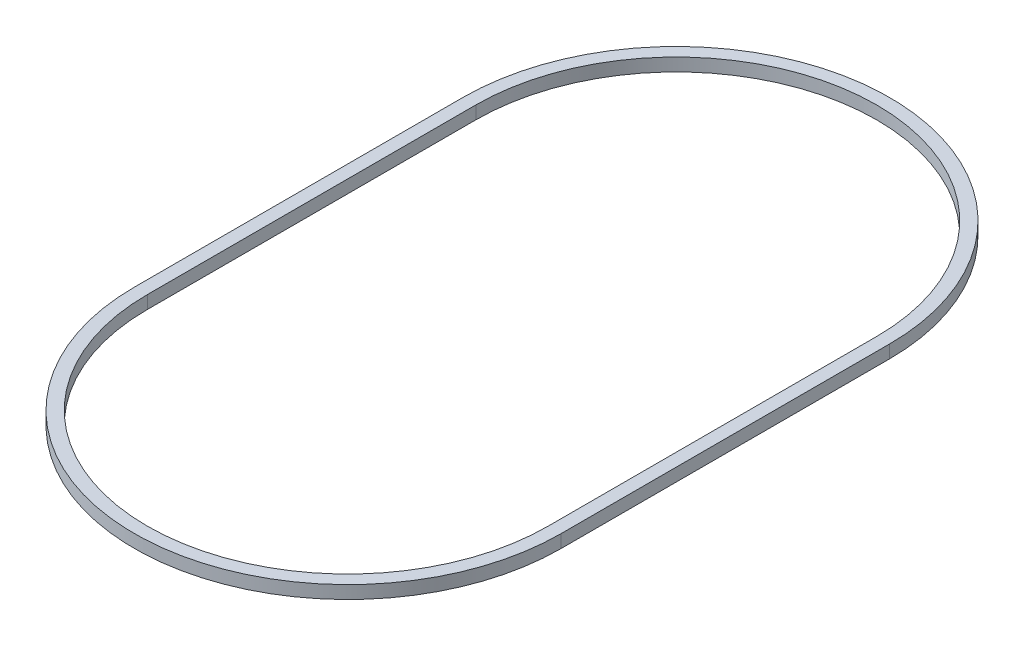
ISO-10303-21;
HEADER;
FILE_DESCRIPTION(('STEP AP214'),'2;1');
FILE_NAME('part.step','',(''),(''),'','','');
FILE_SCHEMA(('AUTOMOTIVE_DESIGN { 1 0 10303 214 1 1 1 1 }'));
ENDSEC;
DATA;
#1=APPLICATION_CONTEXT('core data for automotive mechanical design processes');
#2=APPLICATION_PROTOCOL_DEFINITION('international standard','automotive_design',2000,#1);
#3=PRODUCT_CONTEXT('',#1,'mechanical');
#4=PRODUCT('Part','Part','',(#3));
#5=PRODUCT_RELATED_PRODUCT_CATEGORY('part','',(#4));
#6=PRODUCT_DEFINITION_FORMATION('','',#4);
#7=PRODUCT_DEFINITION_CONTEXT('part definition',#1,'design');
#8=PRODUCT_DEFINITION('design','',#6,#7);
#9=PRODUCT_DEFINITION_SHAPE('','',#8);
#10=(LENGTH_UNIT() NAMED_UNIT(*) SI_UNIT(.MILLI.,.METRE.));
#11=(NAMED_UNIT(*) PLANE_ANGLE_UNIT() SI_UNIT($,.RADIAN.));
#12=(NAMED_UNIT(*) SI_UNIT($,.STERADIAN.) SOLID_ANGLE_UNIT());
#13=UNCERTAINTY_MEASURE_WITH_UNIT(LENGTH_MEASURE(1.E-05),#10,'distance_accuracy_value','');
#14=(GEOMETRIC_REPRESENTATION_CONTEXT(3) GLOBAL_UNCERTAINTY_ASSIGNED_CONTEXT((#13)) GLOBAL_UNIT_ASSIGNED_CONTEXT((#10,
#11,#12)) REPRESENTATION_CONTEXT('',''));
#15=CARTESIAN_POINT('',(0.,0.,0.));
#16=DIRECTION('',(0.,0.,1.));
#17=DIRECTION('',(1.,0.,0.));
#18=AXIS2_PLACEMENT_3D('',#15,#16,#17);
#19=CARTESIAN_POINT('',(0.,2.5,-31.75));
#20=DIRECTION('',(0.,1.,0.));
#21=DIRECTION('',(0.,0.,1.));
#22=AXIS2_PLACEMENT_3D('',#19,#20,#21);
#23=PLANE('',#22);
#24=CARTESIAN_POINT('',(0.,2.5,-31.75));
#25=DIRECTION('',(0.,1.,0.));
#26=DIRECTION('',(0.,0.,1.));
#27=AXIS2_PLACEMENT_3D('',#24,#25,#26);
#28=CIRCLE('',#27,41.25);
#29=CARTESIAN_POINT('',(41.25,2.5,-31.75));
#30=VERTEX_POINT('',#29);
#31=CARTESIAN_POINT('',(-41.25,2.5,-31.75));
#32=VERTEX_POINT('',#31);
#33=EDGE_CURVE('E134',#30,#32,#28,.T.);
#34=ORIENTED_EDGE('',*,*,#33,.T.);
#35=DIRECTION('',(0.,0.,1.));
#36=VECTOR('',#35,1.);
#37=CARTESIAN_POINT('',(-41.25,2.5,-31.75));
#38=LINE('',#37,#36);
#39=CARTESIAN_POINT('',(-41.25,2.5,31.75));
#40=VERTEX_POINT('',#39);
#41=EDGE_CURVE('E137',#32,#40,#38,.T.);
#42=ORIENTED_EDGE('',*,*,#41,.T.);
#43=CARTESIAN_POINT('',(0.,2.5,31.75));
#44=DIRECTION('',(0.,1.,0.));
#45=DIRECTION('',(0.,0.,1.));
#46=AXIS2_PLACEMENT_3D('',#43,#44,#45);
#47=CIRCLE('',#46,41.25);
#48=CARTESIAN_POINT('',(41.25,2.5,31.75));
#49=VERTEX_POINT('',#48);
#50=EDGE_CURVE('E140',#40,#49,#47,.T.);
#51=ORIENTED_EDGE('',*,*,#50,.T.);
#52=DIRECTION('',(0.,0.,-1.));
#53=VECTOR('',#52,1.);
#54=CARTESIAN_POINT('',(41.25,2.5,-31.75));
#55=LINE('',#54,#53);
#56=EDGE_CURVE('E142',#49,#30,#55,.T.);
#57=ORIENTED_EDGE('',*,*,#56,.T.);
#58=EDGE_LOOP('',(#34,#42,#51,#57));
#59=FACE_BOUND('',#58,.T.);
#60=DIRECTION('',(0.,0.,1.));
#61=VECTOR('',#60,1.);
#62=CARTESIAN_POINT('',(-38.75,2.5,-31.75));
#63=LINE('',#62,#61);
#64=CARTESIAN_POINT('',(-38.75,2.5,-31.75));
#65=VERTEX_POINT('',#64);
#66=CARTESIAN_POINT('',(-38.75,2.5,31.75));
#67=VERTEX_POINT('',#66);
#68=EDGE_CURVE('E106',#65,#67,#63,.T.);
#69=ORIENTED_EDGE('',*,*,#68,.F.);
#70=CARTESIAN_POINT('',(0.,2.5,-31.75));
#71=DIRECTION('',(0.,1.,0.));
#72=DIRECTION('',(0.,0.,1.));
#73=AXIS2_PLACEMENT_3D('',#70,#71,#72);
#74=CIRCLE('',#73,38.75);
#75=CARTESIAN_POINT('',(38.75,2.5,-31.75));
#76=VERTEX_POINT('',#75);
#77=EDGE_CURVE('E98',#76,#65,#74,.T.);
#78=ORIENTED_EDGE('',*,*,#77,.F.);
#79=DIRECTION('',(0.,0.,-1.));
#80=VECTOR('',#79,1.);
#81=CARTESIAN_POINT('',(38.75,2.5,-31.75));
#82=LINE('',#81,#80);
#83=CARTESIAN_POINT('',(38.75,2.5,31.75));
#84=VERTEX_POINT('',#83);
#85=EDGE_CURVE('E120',#84,#76,#82,.T.);
#86=ORIENTED_EDGE('',*,*,#85,.F.);
#87=CARTESIAN_POINT('',(0.,2.5,31.75));
#88=DIRECTION('',(0.,1.,0.));
#89=DIRECTION('',(0.,0.,1.));
#90=AXIS2_PLACEMENT_3D('',#87,#88,#89);
#91=CIRCLE('',#90,38.75);
#92=EDGE_CURVE('E118',#67,#84,#91,.T.);
#93=ORIENTED_EDGE('',*,*,#92,.F.);
#94=EDGE_LOOP('',(#69,#78,#86,#93));
#95=FACE_BOUND('',#94,.T.);
#96=ADVANCED_FACE('F33',(#59,#95),#23,.T.);
#97=CARTESIAN_POINT('',(0.,0.,-31.75));
#98=DIRECTION('',(0.,1.,0.));
#99=DIRECTION('',(0.,0.,1.));
#100=AXIS2_PLACEMENT_3D('',#97,#98,#99);
#101=PLANE('',#100);
#102=CARTESIAN_POINT('',(0.,0.,-31.75));
#103=DIRECTION('',(0.,1.,0.));
#104=DIRECTION('',(0.,0.,1.));
#105=AXIS2_PLACEMENT_3D('',#102,#103,#104);
#106=CIRCLE('',#105,41.25);
#107=CARTESIAN_POINT('',(41.25,0.,-31.75));
#108=VERTEX_POINT('',#107);
#109=CARTESIAN_POINT('',(-41.25,0.,-31.75));
#110=VERTEX_POINT('',#109);
#111=EDGE_CURVE('E114',#108,#110,#106,.T.);
#112=ORIENTED_EDGE('',*,*,#111,.F.);
#113=DIRECTION('',(0.,0.,-1.));
#114=VECTOR('',#113,1.);
#115=CARTESIAN_POINT('',(41.25,0.,-31.75));
#116=LINE('',#115,#114);
#117=CARTESIAN_POINT('',(41.25,0.,31.75));
#118=VERTEX_POINT('',#117);
#119=EDGE_CURVE('E138',#118,#108,#116,.T.);
#120=ORIENTED_EDGE('',*,*,#119,.F.);
#121=CARTESIAN_POINT('',(0.,0.,31.75));
#122=DIRECTION('',(0.,1.,0.));
#123=DIRECTION('',(0.,0.,1.));
#124=AXIS2_PLACEMENT_3D('',#121,#122,#123);
#125=CIRCLE('',#124,41.25);
#126=CARTESIAN_POINT('',(-41.25,0.,31.75));
#127=VERTEX_POINT('',#126);
#128=EDGE_CURVE('E149',#127,#118,#125,.T.);
#129=ORIENTED_EDGE('',*,*,#128,.F.);
#130=DIRECTION('',(0.,0.,1.));
#131=VECTOR('',#130,1.);
#132=CARTESIAN_POINT('',(-41.25,0.,-31.75));
#133=LINE('',#132,#131);
#134=EDGE_CURVE('E147',#110,#127,#133,.T.);
#135=ORIENTED_EDGE('',*,*,#134,.F.);
#136=EDGE_LOOP('',(#112,#120,#129,#135));
#137=FACE_BOUND('',#136,.T.);
#138=CARTESIAN_POINT('',(0.,0.,-31.75));
#139=DIRECTION('',(0.,1.,0.));
#140=DIRECTION('',(0.,0.,1.));
#141=AXIS2_PLACEMENT_3D('',#138,#139,#140);
#142=CIRCLE('',#141,38.75);
#143=CARTESIAN_POINT('',(38.75,0.,-31.75));
#144=VERTEX_POINT('',#143);
#145=CARTESIAN_POINT('',(-38.75,0.,-31.75));
#146=VERTEX_POINT('',#145);
#147=EDGE_CURVE('E56',#144,#146,#142,.T.);
#148=ORIENTED_EDGE('',*,*,#147,.T.);
#149=DIRECTION('',(0.,0.,1.));
#150=VECTOR('',#149,1.);
#151=CARTESIAN_POINT('',(-38.75,0.,-31.75));
#152=LINE('',#151,#150);
#153=CARTESIAN_POINT('',(-38.75,0.,31.75));
#154=VERTEX_POINT('',#153);
#155=EDGE_CURVE('E113',#146,#154,#152,.T.);
#156=ORIENTED_EDGE('',*,*,#155,.T.);
#157=CARTESIAN_POINT('',(0.,0.,31.75));
#158=DIRECTION('',(0.,1.,0.));
#159=DIRECTION('',(0.,0.,1.));
#160=AXIS2_PLACEMENT_3D('',#157,#158,#159);
#161=CIRCLE('',#160,38.75);
#162=CARTESIAN_POINT('',(38.75,0.,31.75));
#163=VERTEX_POINT('',#162);
#164=EDGE_CURVE('E126',#154,#163,#161,.T.);
#165=ORIENTED_EDGE('',*,*,#164,.T.);
#166=DIRECTION('',(0.,0.,-1.));
#167=VECTOR('',#166,1.);
#168=CARTESIAN_POINT('',(38.75,0.,-31.75));
#169=LINE('',#168,#167);
#170=EDGE_CURVE('E107',#163,#144,#169,.T.);
#171=ORIENTED_EDGE('',*,*,#170,.T.);
#172=EDGE_LOOP('',(#148,#156,#165,#171));
#173=FACE_BOUND('',#172,.T.);
#174=ADVANCED_FACE('F167',(#137,#173),#101,.F.);
#175=CARTESIAN_POINT('',(0.,2.5,-31.75));
#176=DIRECTION('',(0.,-1.,0.));
#177=DIRECTION('',(0.,0.,-1.));
#178=AXIS2_PLACEMENT_3D('',#175,#176,#177);
#179=CYLINDRICAL_SURFACE('',#178,41.25);
#180=ORIENTED_EDGE('',*,*,#111,.T.);
#181=DIRECTION('',(0.,-1.,0.));
#182=VECTOR('',#181,1.);
#183=CARTESIAN_POINT('',(-41.25,2.5,-31.75));
#184=LINE('',#183,#182);
#185=EDGE_CURVE('E11',#32,#110,#184,.T.);
#186=ORIENTED_EDGE('',*,*,#185,.F.);
#187=ORIENTED_EDGE('',*,*,#33,.F.);
#188=DIRECTION('',(0.,-1.,0.));
#189=VECTOR('',#188,1.);
#190=CARTESIAN_POINT('',(41.25,2.5,-31.75));
#191=LINE('',#190,#189);
#192=EDGE_CURVE('E144',#30,#108,#191,.T.);
#193=ORIENTED_EDGE('',*,*,#192,.T.);
#194=EDGE_LOOP('',(#180,#186,#187,#193));
#195=FACE_BOUND('',#194,.T.);
#196=ADVANCED_FACE('F35',(#195),#179,.T.);
#197=CARTESIAN_POINT('',(-41.25,2.5,-31.75));
#198=DIRECTION('',(1.,0.,0.));
#199=DIRECTION('',(0.,0.,-1.));
#200=AXIS2_PLACEMENT_3D('',#197,#198,#199);
#201=PLANE('',#200);
#202=ORIENTED_EDGE('',*,*,#134,.T.);
#203=DIRECTION('',(0.,-1.,0.));
#204=VECTOR('',#203,1.);
#205=CARTESIAN_POINT('',(-41.25,2.5,31.75));
#206=LINE('',#205,#204);
#207=EDGE_CURVE('E41',#40,#127,#206,.T.);
#208=ORIENTED_EDGE('',*,*,#207,.F.);
#209=ORIENTED_EDGE('',*,*,#41,.F.);
#210=ORIENTED_EDGE('',*,*,#185,.T.);
#211=EDGE_LOOP('',(#202,#208,#209,#210));
#212=FACE_BOUND('',#211,.T.);
#213=ADVANCED_FACE('F177',(#212),#201,.F.);
#214=CARTESIAN_POINT('',(0.,2.5,31.75));
#215=DIRECTION('',(0.,-1.,0.));
#216=DIRECTION('',(0.,0.,-1.));
#217=AXIS2_PLACEMENT_3D('',#214,#215,#216);
#218=CYLINDRICAL_SURFACE('',#217,41.25);
#219=ORIENTED_EDGE('',*,*,#128,.T.);
#220=DIRECTION('',(0.,-1.,0.));
#221=VECTOR('',#220,1.);
#222=CARTESIAN_POINT('',(41.25,2.5,31.75));
#223=LINE('',#222,#221);
#224=EDGE_CURVE('E154',#49,#118,#223,.T.);
#225=ORIENTED_EDGE('',*,*,#224,.F.);
#226=ORIENTED_EDGE('',*,*,#50,.F.);
#227=ORIENTED_EDGE('',*,*,#207,.T.);
#228=EDGE_LOOP('',(#219,#225,#226,#227));
#229=FACE_BOUND('',#228,.T.);
#230=ADVANCED_FACE('F161',(#229),#218,.T.);
#231=CARTESIAN_POINT('',(41.25,2.5,-31.75));
#232=DIRECTION('',(-1.,0.,0.));
#233=DIRECTION('',(0.,0.,1.));
#234=AXIS2_PLACEMENT_3D('',#231,#232,#233);
#235=PLANE('',#234);
#236=ORIENTED_EDGE('',*,*,#119,.T.);
#237=ORIENTED_EDGE('',*,*,#192,.F.);
#238=ORIENTED_EDGE('',*,*,#56,.F.);
#239=ORIENTED_EDGE('',*,*,#224,.T.);
#240=EDGE_LOOP('',(#236,#237,#238,#239));
#241=FACE_BOUND('',#240,.T.);
#242=ADVANCED_FACE('F171',(#241),#235,.F.);
#243=CARTESIAN_POINT('',(0.,2.5,-31.75));
#244=DIRECTION('',(0.,-1.,0.));
#245=DIRECTION('',(0.,0.,-1.));
#246=AXIS2_PLACEMENT_3D('',#243,#244,#245);
#247=CYLINDRICAL_SURFACE('',#246,38.75);
#248=ORIENTED_EDGE('',*,*,#147,.F.);
#249=DIRECTION('',(0.,-1.,0.));
#250=VECTOR('',#249,1.);
#251=CARTESIAN_POINT('',(38.75,2.5,-31.75));
#252=LINE('',#251,#250);
#253=EDGE_CURVE('E102',#76,#144,#252,.T.);
#254=ORIENTED_EDGE('',*,*,#253,.F.);
#255=ORIENTED_EDGE('',*,*,#77,.T.);
#256=DIRECTION('',(0.,-1.,0.));
#257=VECTOR('',#256,1.);
#258=CARTESIAN_POINT('',(-38.75,2.5,-31.75));
#259=LINE('',#258,#257);
#260=EDGE_CURVE('E101',#65,#146,#259,.T.);
#261=ORIENTED_EDGE('',*,*,#260,.T.);
#262=EDGE_LOOP('',(#248,#254,#255,#261));
#263=FACE_BOUND('',#262,.T.);
#264=ADVANCED_FACE('F100',(#263),#247,.F.);
#265=CARTESIAN_POINT('',(-38.75,2.5,-31.75));
#266=DIRECTION('',(1.,0.,0.));
#267=DIRECTION('',(0.,0.,-1.));
#268=AXIS2_PLACEMENT_3D('',#265,#266,#267);
#269=PLANE('',#268);
#270=ORIENTED_EDGE('',*,*,#155,.F.);
#271=ORIENTED_EDGE('',*,*,#260,.F.);
#272=ORIENTED_EDGE('',*,*,#68,.T.);
#273=DIRECTION('',(0.,-1.,0.));
#274=VECTOR('',#273,1.);
#275=CARTESIAN_POINT('',(-38.75,2.5,31.75));
#276=LINE('',#275,#274);
#277=EDGE_CURVE('E115',#67,#154,#276,.T.);
#278=ORIENTED_EDGE('',*,*,#277,.T.);
#279=EDGE_LOOP('',(#270,#271,#272,#278));
#280=FACE_BOUND('',#279,.T.);
#281=ADVANCED_FACE('F110',(#280),#269,.T.);
#282=CARTESIAN_POINT('',(0.,2.5,31.75));
#283=DIRECTION('',(0.,-1.,0.));
#284=DIRECTION('',(0.,0.,-1.));
#285=AXIS2_PLACEMENT_3D('',#282,#283,#284);
#286=CYLINDRICAL_SURFACE('',#285,38.75);
#287=ORIENTED_EDGE('',*,*,#164,.F.);
#288=ORIENTED_EDGE('',*,*,#277,.F.);
#289=ORIENTED_EDGE('',*,*,#92,.T.);
#290=DIRECTION('',(0.,-1.,0.));
#291=VECTOR('',#290,1.);
#292=CARTESIAN_POINT('',(38.75,2.5,31.75));
#293=LINE('',#292,#291);
#294=EDGE_CURVE('E48',#84,#163,#293,.T.);
#295=ORIENTED_EDGE('',*,*,#294,.T.);
#296=EDGE_LOOP('',(#287,#288,#289,#295));
#297=FACE_BOUND('',#296,.T.);
#298=ADVANCED_FACE('F200',(#297),#286,.F.);
#299=CARTESIAN_POINT('',(38.75,2.5,-31.75));
#300=DIRECTION('',(-1.,0.,0.));
#301=DIRECTION('',(0.,0.,1.));
#302=AXIS2_PLACEMENT_3D('',#299,#300,#301);
#303=PLANE('',#302);
#304=ORIENTED_EDGE('',*,*,#170,.F.);
#305=ORIENTED_EDGE('',*,*,#294,.F.);
#306=ORIENTED_EDGE('',*,*,#85,.T.);
#307=ORIENTED_EDGE('',*,*,#253,.T.);
#308=EDGE_LOOP('',(#304,#305,#306,#307));
#309=FACE_BOUND('',#308,.T.);
#310=ADVANCED_FACE('F204',(#309),#303,.T.);
#311=CLOSED_SHELL('',(#96,#174,#196,#213,#230,#242,#264,#281,#298,#310));
#312=MANIFOLD_SOLID_BREP('B2',#311);
#313=ADVANCED_BREP_SHAPE_REPRESENTATION('',(#18,#312),#14);
#314=SHAPE_DEFINITION_REPRESENTATION(#9,#313);
ENDSEC;
END-ISO-10303-21;
